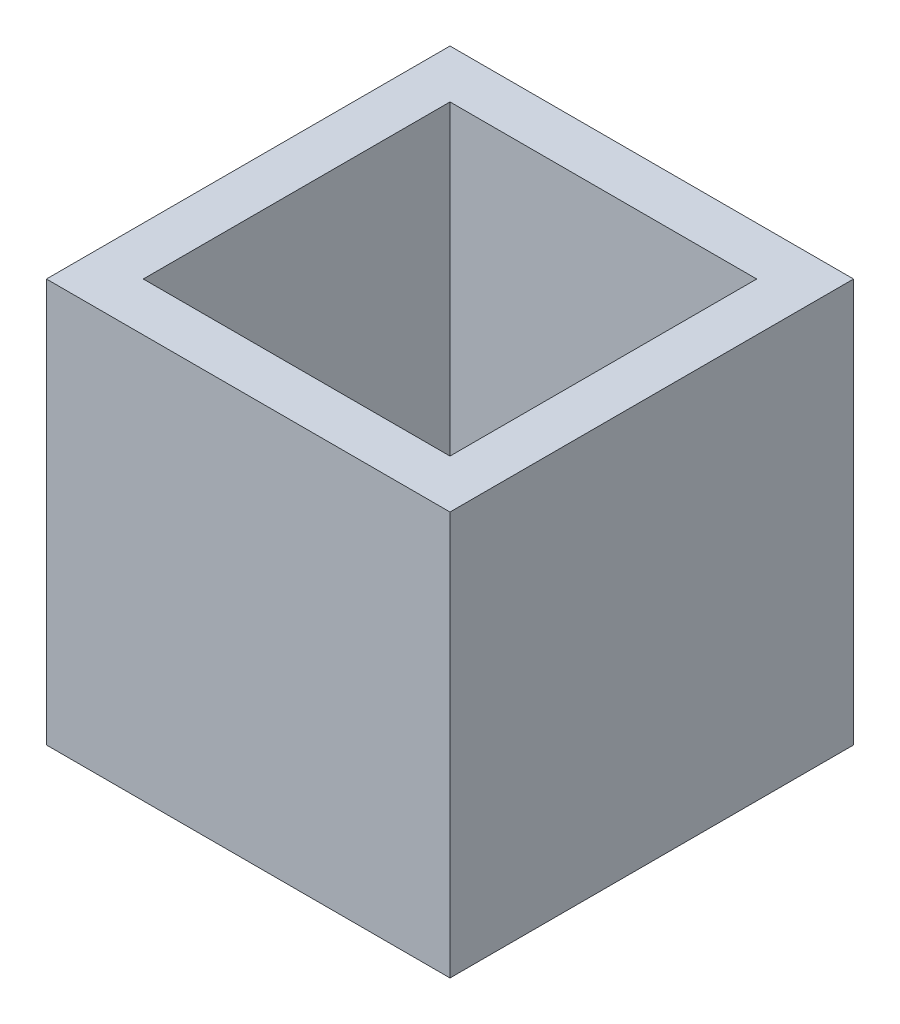
ISO-10303-21;
HEADER;
FILE_DESCRIPTION(('STEP AP214'),'2;1');
FILE_NAME('part.step','',(''),(''),'','','');
FILE_SCHEMA(('AUTOMOTIVE_DESIGN { 1 0 10303 214 1 1 1 1 }'));
ENDSEC;
DATA;
#1=APPLICATION_CONTEXT('core data for automotive mechanical design processes');
#2=APPLICATION_PROTOCOL_DEFINITION('international standard','automotive_design',2000,#1);
#3=PRODUCT_CONTEXT('',#1,'mechanical');
#4=PRODUCT('Part','Part','',(#3));
#5=PRODUCT_RELATED_PRODUCT_CATEGORY('part','',(#4));
#6=PRODUCT_DEFINITION_FORMATION('','',#4);
#7=PRODUCT_DEFINITION_CONTEXT('part definition',#1,'design');
#8=PRODUCT_DEFINITION('design','',#6,#7);
#9=PRODUCT_DEFINITION_SHAPE('','',#8);
#10=(LENGTH_UNIT() NAMED_UNIT(*) SI_UNIT(.MILLI.,.METRE.));
#11=(NAMED_UNIT(*) PLANE_ANGLE_UNIT() SI_UNIT($,.RADIAN.));
#12=(NAMED_UNIT(*) SI_UNIT($,.STERADIAN.) SOLID_ANGLE_UNIT());
#13=UNCERTAINTY_MEASURE_WITH_UNIT(LENGTH_MEASURE(1.E-05),#10,'distance_accuracy_value','');
#14=(GEOMETRIC_REPRESENTATION_CONTEXT(3) GLOBAL_UNCERTAINTY_ASSIGNED_CONTEXT((#13)) GLOBAL_UNIT_ASSIGNED_CONTEXT((#10,
#11,#12)) REPRESENTATION_CONTEXT('',''));
#15=CARTESIAN_POINT('',(0.,0.,0.));
#16=DIRECTION('',(0.,0.,1.));
#17=DIRECTION('',(1.,0.,0.));
#18=AXIS2_PLACEMENT_3D('',#15,#16,#17);
#19=CARTESIAN_POINT('',(-9.49999999999999,25.,12.5));
#20=DIRECTION('',(-1.,0.,0.));
#21=DIRECTION('',(0.,0.,1.));
#22=AXIS2_PLACEMENT_3D('',#19,#20,#21);
#23=PLANE('',#22);
#24=DIRECTION('',(0.,-1.,0.));
#25=VECTOR('',#24,1.);
#26=CARTESIAN_POINT('',(-9.49999999999999,25.,9.50000000000001));
#27=LINE('',#26,#25);
#28=CARTESIAN_POINT('',(-9.49999999999999,25.,9.50000000000001));
#29=VERTEX_POINT('',#28);
#30=CARTESIAN_POINT('',(-9.49999999999999,3.,9.50000000000001));
#31=VERTEX_POINT('',#30);
#32=EDGE_CURVE('E57',#29,#31,#27,.T.);
#33=ORIENTED_EDGE('',*,*,#32,.T.);
#34=DIRECTION('',(0.,0.,-1.));
#35=VECTOR('',#34,1.);
#36=CARTESIAN_POINT('',(-9.49999999999999,3.,0.));
#37=LINE('',#36,#35);
#38=CARTESIAN_POINT('',(-9.49999999999999,3.,-9.49999999999999));
#39=VERTEX_POINT('',#38);
#40=EDGE_CURVE('E49',#31,#39,#37,.T.);
#41=ORIENTED_EDGE('',*,*,#40,.T.);
#42=DIRECTION('',(0.,-1.,0.));
#43=VECTOR('',#42,1.);
#44=CARTESIAN_POINT('',(-9.49999999999999,25.,-9.49999999999999));
#45=LINE('',#44,#43);
#46=CARTESIAN_POINT('',(-9.49999999999999,25.,-9.49999999999999));
#47=VERTEX_POINT('',#46);
#48=EDGE_CURVE('E43',#47,#39,#45,.T.);
#49=ORIENTED_EDGE('',*,*,#48,.F.);
#50=DIRECTION('',(0.,0.,1.));
#51=VECTOR('',#50,1.);
#52=CARTESIAN_POINT('',(-9.49999999999999,25.,-9.49999999999999));
#53=LINE('',#52,#51);
#54=EDGE_CURVE('E139',#47,#29,#53,.T.);
#55=ORIENTED_EDGE('',*,*,#54,.T.);
#56=EDGE_LOOP('',(#33,#41,#49,#55));
#57=FACE_BOUND('',#56,.T.);
#58=ADVANCED_FACE('F39',(#57),#23,.F.);
#59=CARTESIAN_POINT('',(-12.5,25.,9.50000000000001));
#60=DIRECTION('',(0.,0.,-1.));
#61=DIRECTION('',(-1.,0.,0.));
#62=AXIS2_PLACEMENT_3D('',#59,#60,#61);
#63=PLANE('',#62);
#64=DIRECTION('',(0.,-1.,0.));
#65=VECTOR('',#64,1.);
#66=CARTESIAN_POINT('',(9.50000000000001,25.,9.50000000000001));
#67=LINE('',#66,#65);
#68=CARTESIAN_POINT('',(9.50000000000001,25.,9.50000000000001));
#69=VERTEX_POINT('',#68);
#70=CARTESIAN_POINT('',(9.50000000000001,3.,9.50000000000001));
#71=VERTEX_POINT('',#70);
#72=EDGE_CURVE('E124',#69,#71,#67,.T.);
#73=ORIENTED_EDGE('',*,*,#72,.T.);
#74=DIRECTION('',(1.,0.,0.));
#75=VECTOR('',#74,1.);
#76=CARTESIAN_POINT('',(0.,3.,9.50000000000001));
#77=LINE('',#76,#75);
#78=EDGE_CURVE('E194',#31,#71,#77,.T.);
#79=ORIENTED_EDGE('',*,*,#78,.F.);
#80=ORIENTED_EDGE('',*,*,#32,.F.);
#81=DIRECTION('',(1.,0.,0.));
#82=VECTOR('',#81,1.);
#83=CARTESIAN_POINT('',(-9.49999999999999,25.,9.50000000000001));
#84=LINE('',#83,#82);
#85=EDGE_CURVE('E134',#29,#69,#84,.T.);
#86=ORIENTED_EDGE('',*,*,#85,.T.);
#87=EDGE_LOOP('',(#73,#79,#80,#86));
#88=FACE_BOUND('',#87,.T.);
#89=ADVANCED_FACE('F135',(#88),#63,.T.);
#90=CARTESIAN_POINT('',(9.50000000000001,25.,12.5));
#91=DIRECTION('',(-1.,0.,0.));
#92=DIRECTION('',(0.,0.,1.));
#93=AXIS2_PLACEMENT_3D('',#90,#91,#92);
#94=PLANE('',#93);
#95=DIRECTION('',(0.,-1.,0.));
#96=VECTOR('',#95,1.);
#97=CARTESIAN_POINT('',(9.50000000000001,25.,-9.49999999999999));
#98=LINE('',#97,#96);
#99=CARTESIAN_POINT('',(9.50000000000001,25.,-9.49999999999999));
#100=VERTEX_POINT('',#99);
#101=CARTESIAN_POINT('',(9.50000000000001,3.,-9.49999999999999));
#102=VERTEX_POINT('',#101);
#103=EDGE_CURVE('E66',#100,#102,#98,.T.);
#104=ORIENTED_EDGE('',*,*,#103,.T.);
#105=DIRECTION('',(0.,0.,-1.));
#106=VECTOR('',#105,1.);
#107=CARTESIAN_POINT('',(9.50000000000001,3.,0.));
#108=LINE('',#107,#106);
#109=EDGE_CURVE('E129',#71,#102,#108,.T.);
#110=ORIENTED_EDGE('',*,*,#109,.F.);
#111=ORIENTED_EDGE('',*,*,#72,.F.);
#112=DIRECTION('',(0.,0.,-1.));
#113=VECTOR('',#112,1.);
#114=CARTESIAN_POINT('',(9.50000000000001,25.,9.50000000000001));
#115=LINE('',#114,#113);
#116=EDGE_CURVE('E127',#69,#100,#115,.T.);
#117=ORIENTED_EDGE('',*,*,#116,.T.);
#118=EDGE_LOOP('',(#104,#110,#111,#117));
#119=FACE_BOUND('',#118,.T.);
#120=ADVANCED_FACE('F125',(#119),#94,.T.);
#121=CARTESIAN_POINT('',(-12.5,25.,-9.49999999999999));
#122=DIRECTION('',(0.,0.,-1.));
#123=DIRECTION('',(-1.,0.,0.));
#124=AXIS2_PLACEMENT_3D('',#121,#122,#123);
#125=PLANE('',#124);
#126=ORIENTED_EDGE('',*,*,#48,.T.);
#127=DIRECTION('',(1.,0.,0.));
#128=VECTOR('',#127,1.);
#129=CARTESIAN_POINT('',(0.,3.,-9.49999999999999));
#130=LINE('',#129,#128);
#131=EDGE_CURVE('E11',#39,#102,#130,.T.);
#132=ORIENTED_EDGE('',*,*,#131,.T.);
#133=ORIENTED_EDGE('',*,*,#103,.F.);
#134=DIRECTION('',(-1.,0.,0.));
#135=VECTOR('',#134,1.);
#136=CARTESIAN_POINT('',(9.50000000000001,25.,-9.49999999999999));
#137=LINE('',#136,#135);
#138=EDGE_CURVE('E143',#100,#47,#137,.T.);
#139=ORIENTED_EDGE('',*,*,#138,.T.);
#140=EDGE_LOOP('',(#126,#132,#133,#139));
#141=FACE_BOUND('',#140,.T.);
#142=ADVANCED_FACE('F201',(#141),#125,.F.);
#143=CARTESIAN_POINT('',(0.,3.,0.));
#144=DIRECTION('',(0.,-1.,0.));
#145=DIRECTION('',(0.,0.,-1.));
#146=AXIS2_PLACEMENT_3D('',#143,#144,#145);
#147=PLANE('',#146);
#148=ORIENTED_EDGE('',*,*,#40,.F.);
#149=ORIENTED_EDGE('',*,*,#78,.T.);
#150=ORIENTED_EDGE('',*,*,#109,.T.);
#151=ORIENTED_EDGE('',*,*,#131,.F.);
#152=EDGE_LOOP('',(#148,#149,#150,#151));
#153=FACE_BOUND('',#152,.T.);
#154=ADVANCED_FACE('F41',(#153),#147,.F.);
#155=CARTESIAN_POINT('',(-12.5,25.,12.5));
#156=DIRECTION('',(-1.,0.,0.));
#157=DIRECTION('',(0.,0.,1.));
#158=AXIS2_PLACEMENT_3D('',#155,#156,#157);
#159=PLANE('',#158);
#160=DIRECTION('',(0.,0.,-1.));
#161=VECTOR('',#160,1.);
#162=CARTESIAN_POINT('',(-12.5,0.,12.5));
#163=LINE('',#162,#161);
#164=CARTESIAN_POINT('',(-12.5,0.,12.5));
#165=VERTEX_POINT('',#164);
#166=CARTESIAN_POINT('',(-12.5,0.,-12.5));
#167=VERTEX_POINT('',#166);
#168=EDGE_CURVE('E147',#165,#167,#163,.T.);
#169=ORIENTED_EDGE('',*,*,#168,.F.);
#170=DIRECTION('',(0.,-1.,0.));
#171=VECTOR('',#170,1.);
#172=CARTESIAN_POINT('',(-12.5,25.,12.5));
#173=LINE('',#172,#171);
#174=CARTESIAN_POINT('',(-12.5,25.,12.5));
#175=VERTEX_POINT('',#174);
#176=EDGE_CURVE('E89',#175,#165,#173,.T.);
#177=ORIENTED_EDGE('',*,*,#176,.F.);
#178=DIRECTION('',(0.,0.,-1.));
#179=VECTOR('',#178,1.);
#180=CARTESIAN_POINT('',(-12.5,25.,12.5));
#181=LINE('',#180,#179);
#182=CARTESIAN_POINT('',(-12.5,25.,-12.5));
#183=VERTEX_POINT('',#182);
#184=EDGE_CURVE('E151',#175,#183,#181,.T.);
#185=ORIENTED_EDGE('',*,*,#184,.T.);
#186=DIRECTION('',(0.,-1.,0.));
#187=VECTOR('',#186,1.);
#188=CARTESIAN_POINT('',(-12.5,25.,-12.5));
#189=LINE('',#188,#187);
#190=EDGE_CURVE('E115',#183,#167,#189,.T.);
#191=ORIENTED_EDGE('',*,*,#190,.T.);
#192=EDGE_LOOP('',(#169,#177,#185,#191));
#193=FACE_BOUND('',#192,.T.);
#194=ADVANCED_FACE('F207',(#193),#159,.T.);
#195=CARTESIAN_POINT('',(-12.5,25.,12.5));
#196=DIRECTION('',(0.,0.,-1.));
#197=DIRECTION('',(-1.,0.,0.));
#198=AXIS2_PLACEMENT_3D('',#195,#196,#197);
#199=PLANE('',#198);
#200=DIRECTION('',(1.,0.,0.));
#201=VECTOR('',#200,1.);
#202=CARTESIAN_POINT('',(-12.5,0.,12.5));
#203=LINE('',#202,#201);
#204=CARTESIAN_POINT('',(12.5,0.,12.5));
#205=VERTEX_POINT('',#204);
#206=EDGE_CURVE('E107',#165,#205,#203,.T.);
#207=ORIENTED_EDGE('',*,*,#206,.T.);
#208=DIRECTION('',(0.,-1.,0.));
#209=VECTOR('',#208,1.);
#210=CARTESIAN_POINT('',(12.5,25.,12.5));
#211=LINE('',#210,#209);
#212=CARTESIAN_POINT('',(12.5,25.,12.5));
#213=VERTEX_POINT('',#212);
#214=EDGE_CURVE('E178',#213,#205,#211,.T.);
#215=ORIENTED_EDGE('',*,*,#214,.F.);
#216=DIRECTION('',(1.,0.,0.));
#217=VECTOR('',#216,1.);
#218=CARTESIAN_POINT('',(-12.5,25.,12.5));
#219=LINE('',#218,#217);
#220=EDGE_CURVE('E160',#175,#213,#219,.T.);
#221=ORIENTED_EDGE('',*,*,#220,.F.);
#222=ORIENTED_EDGE('',*,*,#176,.T.);
#223=EDGE_LOOP('',(#207,#215,#221,#222));
#224=FACE_BOUND('',#223,.T.);
#225=ADVANCED_FACE('F218',(#224),#199,.F.);
#226=CARTESIAN_POINT('',(12.5,25.,12.5));
#227=DIRECTION('',(-1.,0.,0.));
#228=DIRECTION('',(0.,0.,1.));
#229=AXIS2_PLACEMENT_3D('',#226,#227,#228);
#230=PLANE('',#229);
#231=DIRECTION('',(0.,0.,-1.));
#232=VECTOR('',#231,1.);
#233=CARTESIAN_POINT('',(12.5,0.,12.5));
#234=LINE('',#233,#232);
#235=CARTESIAN_POINT('',(12.5,0.,-12.5));
#236=VERTEX_POINT('',#235);
#237=EDGE_CURVE('E170',#205,#236,#234,.T.);
#238=ORIENTED_EDGE('',*,*,#237,.T.);
#239=DIRECTION('',(0.,-1.,0.));
#240=VECTOR('',#239,1.);
#241=CARTESIAN_POINT('',(12.5,25.,-12.5));
#242=LINE('',#241,#240);
#243=CARTESIAN_POINT('',(12.5,25.,-12.5));
#244=VERTEX_POINT('',#243);
#245=EDGE_CURVE('E181',#244,#236,#242,.T.);
#246=ORIENTED_EDGE('',*,*,#245,.F.);
#247=DIRECTION('',(0.,0.,-1.));
#248=VECTOR('',#247,1.);
#249=CARTESIAN_POINT('',(12.5,25.,12.5));
#250=LINE('',#249,#248);
#251=EDGE_CURVE('E157',#213,#244,#250,.T.);
#252=ORIENTED_EDGE('',*,*,#251,.F.);
#253=ORIENTED_EDGE('',*,*,#214,.T.);
#254=EDGE_LOOP('',(#238,#246,#252,#253));
#255=FACE_BOUND('',#254,.T.);
#256=ADVANCED_FACE('F222',(#255),#230,.F.);
#257=CARTESIAN_POINT('',(-12.5,25.,-12.5));
#258=DIRECTION('',(0.,0.,-1.));
#259=DIRECTION('',(-1.,0.,0.));
#260=AXIS2_PLACEMENT_3D('',#257,#258,#259);
#261=PLANE('',#260);
#262=DIRECTION('',(1.,0.,0.));
#263=VECTOR('',#262,1.);
#264=CARTESIAN_POINT('',(-12.5,0.,-12.5));
#265=LINE('',#264,#263);
#266=EDGE_CURVE('E166',#167,#236,#265,.T.);
#267=ORIENTED_EDGE('',*,*,#266,.F.);
#268=ORIENTED_EDGE('',*,*,#190,.F.);
#269=DIRECTION('',(1.,0.,0.));
#270=VECTOR('',#269,1.);
#271=CARTESIAN_POINT('',(-12.5,25.,-12.5));
#272=LINE('',#271,#270);
#273=EDGE_CURVE('E154',#183,#244,#272,.T.);
#274=ORIENTED_EDGE('',*,*,#273,.T.);
#275=ORIENTED_EDGE('',*,*,#245,.T.);
#276=EDGE_LOOP('',(#267,#268,#274,#275));
#277=FACE_BOUND('',#276,.T.);
#278=ADVANCED_FACE('F219',(#277),#261,.T.);
#279=CARTESIAN_POINT('',(0.,25.,0.));
#280=DIRECTION('',(0.,-1.,0.));
#281=DIRECTION('',(0.,0.,-1.));
#282=AXIS2_PLACEMENT_3D('',#279,#280,#281);
#283=PLANE('',#282);
#284=ORIENTED_EDGE('',*,*,#85,.F.);
#285=ORIENTED_EDGE('',*,*,#54,.F.);
#286=ORIENTED_EDGE('',*,*,#138,.F.);
#287=ORIENTED_EDGE('',*,*,#116,.F.);
#288=EDGE_LOOP('',(#284,#285,#286,#287));
#289=FACE_BOUND('',#288,.T.);
#290=ORIENTED_EDGE('',*,*,#184,.F.);
#291=ORIENTED_EDGE('',*,*,#220,.T.);
#292=ORIENTED_EDGE('',*,*,#251,.T.);
#293=ORIENTED_EDGE('',*,*,#273,.F.);
#294=EDGE_LOOP('',(#290,#291,#292,#293));
#295=FACE_BOUND('',#294,.T.);
#296=ADVANCED_FACE('F141',(#289,#295),#283,.F.);
#297=CARTESIAN_POINT('',(0.,0.,0.));
#298=DIRECTION('',(0.,-1.,0.));
#299=DIRECTION('',(0.,0.,-1.));
#300=AXIS2_PLACEMENT_3D('',#297,#298,#299);
#301=PLANE('',#300);
#302=ORIENTED_EDGE('',*,*,#168,.T.);
#303=ORIENTED_EDGE('',*,*,#266,.T.);
#304=ORIENTED_EDGE('',*,*,#237,.F.);
#305=ORIENTED_EDGE('',*,*,#206,.F.);
#306=EDGE_LOOP('',(#302,#303,#304,#305));
#307=FACE_BOUND('',#306,.T.);
#308=ADVANCED_FACE('F228',(#307),#301,.T.);
#309=CLOSED_SHELL('',(#58,#89,#120,#142,#154,#194,#225,#256,#278,#296,#308));
#310=MANIFOLD_SOLID_BREP('B2',#309);
#311=ADVANCED_BREP_SHAPE_REPRESENTATION('',(#18,#310),#14);
#312=SHAPE_DEFINITION_REPRESENTATION(#9,#311);
ENDSEC;
END-ISO-10303-21;
